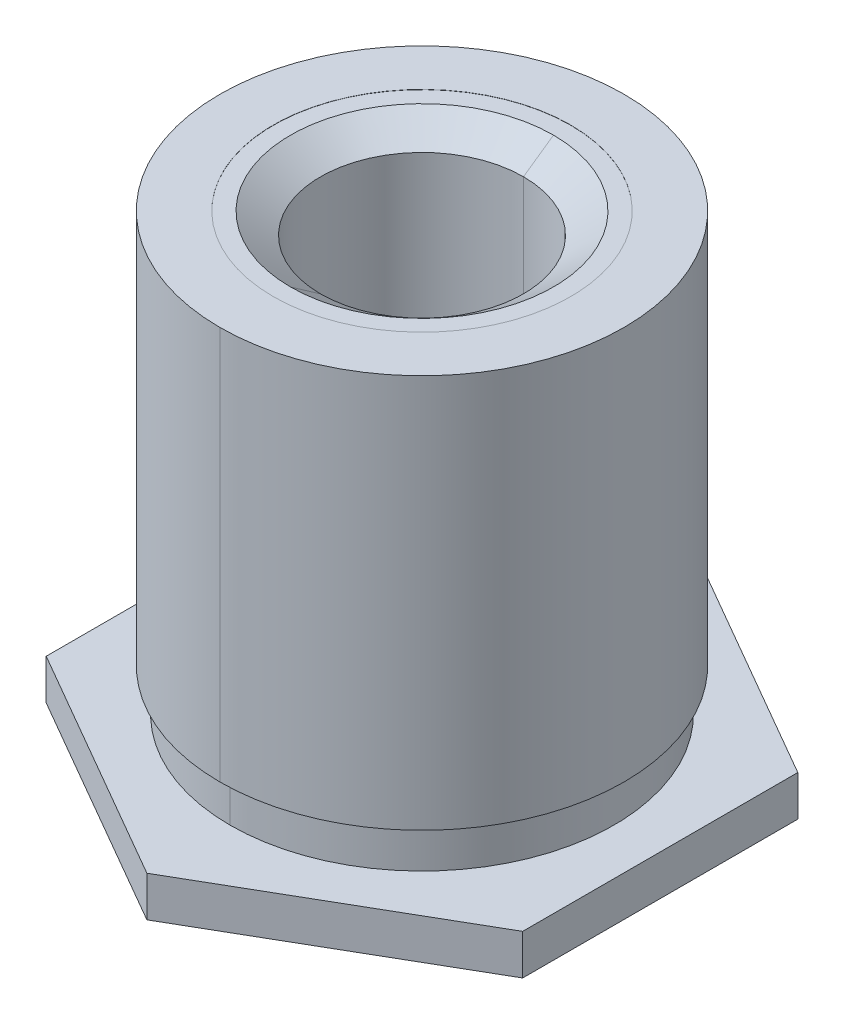
ISO-10303-21;
HEADER;
FILE_DESCRIPTION(('STEP AP214'),'2;1');
FILE_NAME('part.step','',(''),(''),'','','');
FILE_SCHEMA(('AUTOMOTIVE_DESIGN { 1 0 10303 214 1 1 1 1 }'));
ENDSEC;
DATA;
#1=APPLICATION_CONTEXT('core data for automotive mechanical design processes');
#2=APPLICATION_PROTOCOL_DEFINITION('international standard','automotive_design',2000,#1);
#3=PRODUCT_CONTEXT('',#1,'mechanical');
#4=PRODUCT('Part','Part','',(#3));
#5=PRODUCT_RELATED_PRODUCT_CATEGORY('part','',(#4));
#6=PRODUCT_DEFINITION_FORMATION('','',#4);
#7=PRODUCT_DEFINITION_CONTEXT('part definition',#1,'design');
#8=PRODUCT_DEFINITION('design','',#6,#7);
#9=PRODUCT_DEFINITION_SHAPE('','',#8);
#10=(LENGTH_UNIT() NAMED_UNIT(*) SI_UNIT(.MILLI.,.METRE.));
#11=(NAMED_UNIT(*) PLANE_ANGLE_UNIT() SI_UNIT($,.RADIAN.));
#12=(NAMED_UNIT(*) SI_UNIT($,.STERADIAN.) SOLID_ANGLE_UNIT());
#13=UNCERTAINTY_MEASURE_WITH_UNIT(LENGTH_MEASURE(1.E-05),#10,'distance_accuracy_value','');
#14=(GEOMETRIC_REPRESENTATION_CONTEXT(3) GLOBAL_UNCERTAINTY_ASSIGNED_CONTEXT((#13)) GLOBAL_UNIT_ASSIGNED_CONTEXT((#10,
#11,#12)) REPRESENTATION_CONTEXT('',''));
#15=CARTESIAN_POINT('',(0.,0.,0.));
#16=DIRECTION('',(0.,0.,1.));
#17=DIRECTION('',(1.,0.,0.));
#18=AXIS2_PLACEMENT_3D('',#15,#16,#17);
#19=CARTESIAN_POINT('',(3.175,0.,-1.83308710467706));
#20=DIRECTION('',(1.,0.,0.));
#21=DIRECTION('',(0.,1.,0.));
#22=AXIS2_PLACEMENT_3D('',#19,#20,#21);
#23=PLANE('',#22);
#24=DIRECTION('',(0.,0.,-1.));
#25=VECTOR('',#24,1.);
#26=CARTESIAN_POINT('',(3.175,0.53848,-1.83308710467706));
#27=LINE('',#26,#25);
#28=CARTESIAN_POINT('',(3.175,0.53848,1.83308710467706));
#29=VERTEX_POINT('',#28);
#30=CARTESIAN_POINT('',(3.175,0.53848,-1.83308710467706));
#31=VERTEX_POINT('',#30);
#32=EDGE_CURVE('E258',#29,#31,#27,.T.);
#33=ORIENTED_EDGE('',*,*,#32,.F.);
#34=DIRECTION('',(0.,1.,0.));
#35=VECTOR('',#34,1.);
#36=CARTESIAN_POINT('',(3.175,0.,1.83308710467706));
#37=LINE('',#36,#35);
#38=CARTESIAN_POINT('',(3.175,0.,1.83308710467706));
#39=VERTEX_POINT('',#38);
#40=EDGE_CURVE('E138',#39,#29,#37,.T.);
#41=ORIENTED_EDGE('',*,*,#40,.F.);
#42=DIRECTION('',(0.,0.,-1.));
#43=VECTOR('',#42,1.);
#44=CARTESIAN_POINT('',(3.175,0.,-1.83308710467706));
#45=LINE('',#44,#43);
#46=CARTESIAN_POINT('',(3.175,0.,-1.83308710467706));
#47=VERTEX_POINT('',#46);
#48=EDGE_CURVE('E242',#39,#47,#45,.T.);
#49=ORIENTED_EDGE('',*,*,#48,.T.);
#50=DIRECTION('',(0.,1.,0.));
#51=VECTOR('',#50,1.);
#52=CARTESIAN_POINT('',(3.175,0.,-1.83308710467706));
#53=LINE('',#52,#51);
#54=EDGE_CURVE('E11',#47,#31,#53,.T.);
#55=ORIENTED_EDGE('',*,*,#54,.T.);
#56=EDGE_LOOP('',(#33,#41,#49,#55));
#57=FACE_BOUND('',#56,.T.);
#58=ADVANCED_FACE('F16',(#57),#23,.T.);
#59=CARTESIAN_POINT('',(0.,0.,-3.66617420935412));
#60=DIRECTION('',(0.5,0.,-0.866025403784439));
#61=DIRECTION('',(0.,-1.,0.));
#62=AXIS2_PLACEMENT_3D('',#59,#60,#61);
#63=PLANE('',#62);
#64=DIRECTION('',(-0.866025403784439,0.,-0.5));
#65=VECTOR('',#64,1.);
#66=CARTESIAN_POINT('',(0.,0.53848,-3.66617420935412));
#67=LINE('',#66,#65);
#68=CARTESIAN_POINT('',(0.,0.53848,-3.66617420935412));
#69=VERTEX_POINT('',#68);
#70=EDGE_CURVE('E241',#31,#69,#67,.T.);
#71=ORIENTED_EDGE('',*,*,#70,.F.);
#72=ORIENTED_EDGE('',*,*,#54,.F.);
#73=DIRECTION('',(-0.866025403784439,0.,-0.5));
#74=VECTOR('',#73,1.);
#75=CARTESIAN_POINT('',(0.,0.,-3.66617420935412));
#76=LINE('',#75,#74);
#77=CARTESIAN_POINT('',(0.,0.,-3.66617420935412));
#78=VERTEX_POINT('',#77);
#79=EDGE_CURVE('E199',#47,#78,#76,.T.);
#80=ORIENTED_EDGE('',*,*,#79,.T.);
#81=DIRECTION('',(0.,1.,0.));
#82=VECTOR('',#81,1.);
#83=CARTESIAN_POINT('',(0.,0.,-3.66617420935412));
#84=LINE('',#83,#82);
#85=EDGE_CURVE('E27',#78,#69,#84,.T.);
#86=ORIENTED_EDGE('',*,*,#85,.T.);
#87=EDGE_LOOP('',(#71,#72,#80,#86));
#88=FACE_BOUND('',#87,.T.);
#89=ADVANCED_FACE('F435',(#88),#63,.T.);
#90=CARTESIAN_POINT('',(-3.175,0.,-1.83308710467706));
#91=DIRECTION('',(-0.5,0.,-0.866025403784439));
#92=DIRECTION('',(-0.866025403784439,0.,0.5));
#93=AXIS2_PLACEMENT_3D('',#90,#91,#92);
#94=PLANE('',#93);
#95=DIRECTION('',(-0.866025403784439,0.,0.5));
#96=VECTOR('',#95,1.);
#97=CARTESIAN_POINT('',(-3.175,0.53848,-1.83308710467706));
#98=LINE('',#97,#96);
#99=CARTESIAN_POINT('',(-3.175,0.53848,-1.83308710467706));
#100=VERTEX_POINT('',#99);
#101=EDGE_CURVE('E236',#69,#100,#98,.T.);
#102=ORIENTED_EDGE('',*,*,#101,.F.);
#103=ORIENTED_EDGE('',*,*,#85,.F.);
#104=DIRECTION('',(-0.866025403784439,0.,0.5));
#105=VECTOR('',#104,1.);
#106=CARTESIAN_POINT('',(-3.175,0.,-1.83308710467706));
#107=LINE('',#106,#105);
#108=CARTESIAN_POINT('',(-3.175,0.,-1.83308710467706));
#109=VERTEX_POINT('',#108);
#110=EDGE_CURVE('E320',#78,#109,#107,.T.);
#111=ORIENTED_EDGE('',*,*,#110,.T.);
#112=DIRECTION('',(0.,1.,0.));
#113=VECTOR('',#112,1.);
#114=CARTESIAN_POINT('',(-3.175,0.,-1.83308710467706));
#115=LINE('',#114,#113);
#116=EDGE_CURVE('E224',#109,#100,#115,.T.);
#117=ORIENTED_EDGE('',*,*,#116,.T.);
#118=EDGE_LOOP('',(#102,#103,#111,#117));
#119=FACE_BOUND('',#118,.T.);
#120=ADVANCED_FACE('F441',(#119),#94,.T.);
#121=CARTESIAN_POINT('',(-3.175,0.,1.83308710467706));
#122=DIRECTION('',(-1.,0.,0.));
#123=DIRECTION('',(0.,0.,1.));
#124=AXIS2_PLACEMENT_3D('',#121,#122,#123);
#125=PLANE('',#124);
#126=DIRECTION('',(0.,0.,1.));
#127=VECTOR('',#126,1.);
#128=CARTESIAN_POINT('',(-3.175,0.53848,1.83308710467706));
#129=LINE('',#128,#127);
#130=CARTESIAN_POINT('',(-3.175,0.53848,1.83308710467706));
#131=VERTEX_POINT('',#130);
#132=EDGE_CURVE('E240',#100,#131,#129,.T.);
#133=ORIENTED_EDGE('',*,*,#132,.F.);
#134=ORIENTED_EDGE('',*,*,#116,.F.);
#135=DIRECTION('',(0.,0.,1.));
#136=VECTOR('',#135,1.);
#137=CARTESIAN_POINT('',(-3.175,0.,1.83308710467706));
#138=LINE('',#137,#136);
#139=CARTESIAN_POINT('',(-3.175,0.,1.83308710467706));
#140=VERTEX_POINT('',#139);
#141=EDGE_CURVE('E323',#109,#140,#138,.T.);
#142=ORIENTED_EDGE('',*,*,#141,.T.);
#143=DIRECTION('',(0.,1.,0.));
#144=VECTOR('',#143,1.);
#145=CARTESIAN_POINT('',(-3.175,0.,1.83308710467706));
#146=LINE('',#145,#144);
#147=EDGE_CURVE('E20',#140,#131,#146,.T.);
#148=ORIENTED_EDGE('',*,*,#147,.T.);
#149=EDGE_LOOP('',(#133,#134,#142,#148));
#150=FACE_BOUND('',#149,.T.);
#151=ADVANCED_FACE('F476',(#150),#125,.T.);
#152=CARTESIAN_POINT('',(0.,0.,3.66617420935412));
#153=DIRECTION('',(-0.5,0.,0.866025403784439));
#154=DIRECTION('',(0.,1.,0.));
#155=AXIS2_PLACEMENT_3D('',#152,#153,#154);
#156=PLANE('',#155);
#157=DIRECTION('',(0.866025403784439,0.,0.5));
#158=VECTOR('',#157,1.);
#159=CARTESIAN_POINT('',(0.,0.53848,3.66617420935412));
#160=LINE('',#159,#158);
#161=CARTESIAN_POINT('',(0.,0.53848,3.66617420935412));
#162=VERTEX_POINT('',#161);
#163=EDGE_CURVE('E259',#131,#162,#160,.T.);
#164=ORIENTED_EDGE('',*,*,#163,.F.);
#165=ORIENTED_EDGE('',*,*,#147,.F.);
#166=DIRECTION('',(0.866025403784439,0.,0.5));
#167=VECTOR('',#166,1.);
#168=CARTESIAN_POINT('',(0.,0.,3.66617420935412));
#169=LINE('',#168,#167);
#170=CARTESIAN_POINT('',(0.,0.,3.66617420935412));
#171=VERTEX_POINT('',#170);
#172=EDGE_CURVE('E319',#140,#171,#169,.T.);
#173=ORIENTED_EDGE('',*,*,#172,.T.);
#174=DIRECTION('',(0.,1.,0.));
#175=VECTOR('',#174,1.);
#176=CARTESIAN_POINT('',(0.,0.,3.66617420935412));
#177=LINE('',#176,#175);
#178=EDGE_CURVE('E152',#171,#162,#177,.T.);
#179=ORIENTED_EDGE('',*,*,#178,.T.);
#180=EDGE_LOOP('',(#164,#165,#173,#179));
#181=FACE_BOUND('',#180,.T.);
#182=ADVANCED_FACE('F724',(#181),#156,.T.);
#183=CARTESIAN_POINT('',(3.175,0.,1.83308710467706));
#184=DIRECTION('',(0.5,0.,0.866025403784439));
#185=DIRECTION('',(0.,-1.,0.));
#186=AXIS2_PLACEMENT_3D('',#183,#184,#185);
#187=PLANE('',#186);
#188=DIRECTION('',(0.866025403784439,0.,-0.5));
#189=VECTOR('',#188,1.);
#190=CARTESIAN_POINT('',(3.175,0.53848,1.83308710467706));
#191=LINE('',#190,#189);
#192=EDGE_CURVE('E254',#162,#29,#191,.T.);
#193=ORIENTED_EDGE('',*,*,#192,.F.);
#194=ORIENTED_EDGE('',*,*,#178,.F.);
#195=DIRECTION('',(0.866025403784439,0.,-0.5));
#196=VECTOR('',#195,1.);
#197=CARTESIAN_POINT('',(3.175,0.,1.83308710467706));
#198=LINE('',#197,#196);
#199=EDGE_CURVE('E246',#171,#39,#198,.T.);
#200=ORIENTED_EDGE('',*,*,#199,.T.);
#201=ORIENTED_EDGE('',*,*,#40,.T.);
#202=EDGE_LOOP('',(#193,#194,#200,#201));
#203=FACE_BOUND('',#202,.T.);
#204=ADVANCED_FACE('F18',(#203),#187,.T.);
#205=CARTESIAN_POINT('',(0.,-2.54,0.));
#206=DIRECTION('',(0.,-1.,0.));
#207=DIRECTION('',(0.,0.,-1.));
#208=AXIS2_PLACEMENT_3D('',#205,#206,#207);
#209=CYLINDRICAL_SURFACE('',#208,1.9812);
#210=DIRECTION('',(0.,-1.,0.));
#211=VECTOR('',#210,1.);
#212=CARTESIAN_POINT('',(0.,-2.54,1.9812));
#213=LINE('',#212,#211);
#214=CARTESIAN_POINT('',(0.,6.35,1.9812));
#215=VERTEX_POINT('',#214);
#216=CARTESIAN_POINT('',(0.,6.34746,1.9812));
#217=VERTEX_POINT('',#216);
#218=EDGE_CURVE('E276',#215,#217,#213,.T.);
#219=ORIENTED_EDGE('',*,*,#218,.F.);
#220=CARTESIAN_POINT('',(0.,6.35,0.));
#221=DIRECTION('',(0.,1.,0.));
#222=DIRECTION('',(0.,0.,1.));
#223=AXIS2_PLACEMENT_3D('',#220,#221,#222);
#224=CIRCLE('',#223,1.9812);
#225=CARTESIAN_POINT('',(0.,6.35,-1.9812));
#226=VERTEX_POINT('',#225);
#227=EDGE_CURVE('E225',#215,#226,#224,.T.);
#228=ORIENTED_EDGE('',*,*,#227,.T.);
#229=DIRECTION('',(0.,-1.,0.));
#230=VECTOR('',#229,1.);
#231=CARTESIAN_POINT('',(0.,-2.54,-1.9812));
#232=LINE('',#231,#230);
#233=CARTESIAN_POINT('',(0.,6.34746,-1.9812));
#234=VERTEX_POINT('',#233);
#235=EDGE_CURVE('E291',#226,#234,#232,.T.);
#236=ORIENTED_EDGE('',*,*,#235,.T.);
#237=CARTESIAN_POINT('',(0.,6.34746,0.));
#238=DIRECTION('',(0.,-1.,0.));
#239=DIRECTION('',(0.,0.,-1.));
#240=AXIS2_PLACEMENT_3D('',#237,#238,#239);
#241=CIRCLE('',#240,1.9812);
#242=EDGE_CURVE('E279',#234,#217,#241,.T.);
#243=ORIENTED_EDGE('',*,*,#242,.T.);
#244=EDGE_LOOP('',(#219,#228,#236,#243));
#245=FACE_BOUND('',#244,.T.);
#246=ADVANCED_FACE('F461',(#245),#209,.F.);
#247=CARTESIAN_POINT('',(0.,6.06744601654146,0.));
#248=DIRECTION('',(0.,1.,0.));
#249=DIRECTION('',(0.,0.,1.));
#250=AXIS2_PLACEMENT_3D('',#247,#248,#249);
#251=CONICAL_SURFACE('',#250,1.35255,0.960105621522078);
#252=DIRECTION('',(0.,0.573433458613233,-0.819252139785345));
#253=VECTOR('',#252,1.);
#254=CARTESIAN_POINT('',(0.,6.06744601654146,-1.35255));
#255=LINE('',#254,#253);
#256=CARTESIAN_POINT('',(0.,6.06744601654146,-1.35255));
#257=VERTEX_POINT('',#256);
#258=CARTESIAN_POINT('',(0.,6.34746,-1.7526));
#259=VERTEX_POINT('',#258);
#260=EDGE_CURVE('E290',#257,#259,#255,.T.);
#261=ORIENTED_EDGE('',*,*,#260,.F.);
#262=CARTESIAN_POINT('',(0.,6.06744601654146,0.));
#263=DIRECTION('',(0.,-1.,0.));
#264=DIRECTION('',(0.,0.,-1.));
#265=AXIS2_PLACEMENT_3D('',#262,#263,#264);
#266=CIRCLE('',#265,1.35255);
#267=CARTESIAN_POINT('',(0.,6.06744601654146,1.35255));
#268=VERTEX_POINT('',#267);
#269=EDGE_CURVE('E228',#257,#268,#266,.T.);
#270=ORIENTED_EDGE('',*,*,#269,.T.);
#271=DIRECTION('',(0.,0.573433458613233,0.819252139785345));
#272=VECTOR('',#271,1.);
#273=CARTESIAN_POINT('',(0.,6.06744601654146,1.35255));
#274=LINE('',#273,#272);
#275=CARTESIAN_POINT('',(0.,6.34746,1.7526));
#276=VERTEX_POINT('',#275);
#277=EDGE_CURVE('E253',#268,#276,#274,.T.);
#278=ORIENTED_EDGE('',*,*,#277,.T.);
#279=CARTESIAN_POINT('',(0.,6.34746,0.));
#280=DIRECTION('',(0.,-1.,0.));
#281=DIRECTION('',(0.,0.,-1.));
#282=AXIS2_PLACEMENT_3D('',#279,#280,#281);
#283=CIRCLE('',#282,1.7526);
#284=EDGE_CURVE('E232',#259,#276,#283,.T.);
#285=ORIENTED_EDGE('',*,*,#284,.F.);
#286=EDGE_LOOP('',(#261,#270,#278,#285));
#287=FACE_BOUND('',#286,.T.);
#288=ADVANCED_FACE('F367',(#287),#251,.F.);
#289=CARTESIAN_POINT('',(1.9812,6.34746,0.));
#290=DIRECTION('',(0.,-1.,0.));
#291=DIRECTION('',(0.,0.,-1.));
#292=AXIS2_PLACEMENT_3D('',#289,#290,#291);
#293=PLANE('',#292);
#294=CARTESIAN_POINT('',(0.,6.34746,0.));
#295=DIRECTION('',(0.,-1.,0.));
#296=DIRECTION('',(0.,0.,-1.));
#297=AXIS2_PLACEMENT_3D('',#294,#295,#296);
#298=CIRCLE('',#297,1.7526);
#299=EDGE_CURVE('E309',#276,#259,#298,.T.);
#300=ORIENTED_EDGE('',*,*,#299,.T.);
#301=ORIENTED_EDGE('',*,*,#284,.T.);
#302=EDGE_LOOP('',(#300,#301));
#303=FACE_BOUND('',#302,.T.);
#304=ORIENTED_EDGE('',*,*,#242,.F.);
#305=CARTESIAN_POINT('',(0.,6.34746,0.));
#306=DIRECTION('',(0.,-1.,0.));
#307=DIRECTION('',(0.,0.,-1.));
#308=AXIS2_PLACEMENT_3D('',#305,#306,#307);
#309=CIRCLE('',#308,1.9812);
#310=EDGE_CURVE('E303',#217,#234,#309,.T.);
#311=ORIENTED_EDGE('',*,*,#310,.F.);
#312=EDGE_LOOP('',(#304,#311));
#313=FACE_BOUND('',#312,.T.);
#314=ADVANCED_FACE('F363',(#303,#313),#293,.F.);
#315=CARTESIAN_POINT('',(0.,0.,0.));
#316=DIRECTION('',(0.,-1.,0.));
#317=DIRECTION('',(0.,0.,-1.));
#318=AXIS2_PLACEMENT_3D('',#315,#316,#317);
#319=CYLINDRICAL_SURFACE('',#318,2.6924);
#320=DIRECTION('',(0.,-1.,0.));
#321=VECTOR('',#320,1.);
#322=CARTESIAN_POINT('',(0.,0.,2.6924));
#323=LINE('',#322,#321);
#324=CARTESIAN_POINT('',(0.,0.00254000000000007,2.6924));
#325=VERTEX_POINT('',#324);
#326=CARTESIAN_POINT('',(0.,0.,2.6924));
#327=VERTEX_POINT('',#326);
#328=EDGE_CURVE('E209',#325,#327,#323,.T.);
#329=ORIENTED_EDGE('',*,*,#328,.F.);
#330=CARTESIAN_POINT('',(0.,0.00254000000000007,0.));
#331=DIRECTION('',(0.,-1.,0.));
#332=DIRECTION('',(0.,0.,-1.));
#333=AXIS2_PLACEMENT_3D('',#330,#331,#332);
#334=CIRCLE('',#333,2.6924);
#335=CARTESIAN_POINT('',(0.,0.00254000000000007,-2.6924));
#336=VERTEX_POINT('',#335);
#337=EDGE_CURVE('E116',#336,#325,#334,.T.);
#338=ORIENTED_EDGE('',*,*,#337,.F.);
#339=DIRECTION('',(0.,-1.,0.));
#340=VECTOR('',#339,1.);
#341=CARTESIAN_POINT('',(0.,0.,-2.6924));
#342=LINE('',#341,#340);
#343=CARTESIAN_POINT('',(0.,0.,-2.6924));
#344=VERTEX_POINT('',#343);
#345=EDGE_CURVE('E201',#336,#344,#342,.T.);
#346=ORIENTED_EDGE('',*,*,#345,.T.);
#347=CARTESIAN_POINT('',(0.,0.,0.));
#348=DIRECTION('',(0.,-1.,0.));
#349=DIRECTION('',(0.,0.,-1.));
#350=AXIS2_PLACEMENT_3D('',#347,#348,#349);
#351=CIRCLE('',#350,2.6924);
#352=EDGE_CURVE('E191',#344,#327,#351,.T.);
#353=ORIENTED_EDGE('',*,*,#352,.T.);
#354=EDGE_LOOP('',(#329,#338,#346,#353));
#355=FACE_BOUND('',#354,.T.);
#356=ADVANCED_FACE('F202',(#355),#319,.F.);
#357=CARTESIAN_POINT('',(2.6924,0.00253999999999981,0.));
#358=DIRECTION('',(0.,-1.,0.));
#359=DIRECTION('',(0.,0.,-1.));
#360=AXIS2_PLACEMENT_3D('',#357,#358,#359);
#361=PLANE('',#360);
#362=CARTESIAN_POINT('',(0.,0.00253999999999981,0.));
#363=DIRECTION('',(0.,-1.,0.));
#364=DIRECTION('',(0.,0.,-1.));
#365=AXIS2_PLACEMENT_3D('',#362,#363,#364);
#366=CIRCLE('',#365,1.35255);
#367=CARTESIAN_POINT('',(0.,0.00253999999999981,-1.35255));
#368=VERTEX_POINT('',#367);
#369=CARTESIAN_POINT('',(0.,0.00253999999999981,1.35255));
#370=VERTEX_POINT('',#369);
#371=EDGE_CURVE('E280',#368,#370,#366,.T.);
#372=ORIENTED_EDGE('',*,*,#371,.F.);
#373=CARTESIAN_POINT('',(0.,0.00253999999999981,0.));
#374=DIRECTION('',(0.,-1.,0.));
#375=DIRECTION('',(0.,0.,-1.));
#376=AXIS2_PLACEMENT_3D('',#373,#374,#375);
#377=CIRCLE('',#376,1.35255);
#378=EDGE_CURVE('E250',#370,#368,#377,.T.);
#379=ORIENTED_EDGE('',*,*,#378,.F.);
#380=EDGE_LOOP('',(#372,#379));
#381=FACE_BOUND('',#380,.T.);
#382=ORIENTED_EDGE('',*,*,#337,.T.);
#383=CARTESIAN_POINT('',(0.,0.00254000000000007,0.));
#384=DIRECTION('',(0.,-1.,0.));
#385=DIRECTION('',(0.,0.,-1.));
#386=AXIS2_PLACEMENT_3D('',#383,#384,#385);
#387=CIRCLE('',#386,2.6924);
#388=EDGE_CURVE('E216',#325,#336,#387,.T.);
#389=ORIENTED_EDGE('',*,*,#388,.T.);
#390=EDGE_LOOP('',(#382,#389));
#391=FACE_BOUND('',#390,.T.);
#392=ADVANCED_FACE('F464',(#381,#391),#361,.T.);
#393=CARTESIAN_POINT('',(0.,0.,0.));
#394=DIRECTION('',(0.,-1.,0.));
#395=DIRECTION('',(0.,0.,-1.));
#396=AXIS2_PLACEMENT_3D('',#393,#394,#395);
#397=CYLINDRICAL_SURFACE('',#396,1.35255);
#398=DIRECTION('',(0.,-1.,0.));
#399=VECTOR('',#398,1.);
#400=CARTESIAN_POINT('',(0.,0.,1.35255));
#401=LINE('',#400,#399);
#402=EDGE_CURVE('E206',#268,#370,#401,.T.);
#403=ORIENTED_EDGE('',*,*,#402,.F.);
#404=ORIENTED_EDGE('',*,*,#269,.F.);
#405=DIRECTION('',(0.,-1.,0.));
#406=VECTOR('',#405,1.);
#407=CARTESIAN_POINT('',(0.,0.,-1.35255));
#408=LINE('',#407,#406);
#409=EDGE_CURVE('E302',#257,#368,#408,.T.);
#410=ORIENTED_EDGE('',*,*,#409,.T.);
#411=ORIENTED_EDGE('',*,*,#371,.T.);
#412=EDGE_LOOP('',(#403,#404,#410,#411));
#413=FACE_BOUND('',#412,.T.);
#414=ADVANCED_FACE('F466',(#413),#397,.F.);
#415=CARTESIAN_POINT('',(2.6924,6.35,0.));
#416=DIRECTION('',(0.,1.,0.));
#417=DIRECTION('',(1.,0.,0.));
#418=AXIS2_PLACEMENT_3D('',#415,#416,#417);
#419=PLANE('',#418);
#420=CARTESIAN_POINT('',(0.,6.35,0.));
#421=DIRECTION('',(0.,1.,0.));
#422=DIRECTION('',(0.,0.,1.));
#423=AXIS2_PLACEMENT_3D('',#420,#421,#422);
#424=CIRCLE('',#423,1.9812);
#425=EDGE_CURVE('E272',#226,#215,#424,.T.);
#426=ORIENTED_EDGE('',*,*,#425,.F.);
#427=ORIENTED_EDGE('',*,*,#227,.F.);
#428=EDGE_LOOP('',(#426,#427));
#429=FACE_BOUND('',#428,.T.);
#430=CARTESIAN_POINT('',(0.,6.35,0.));
#431=DIRECTION('',(0.,-1.,0.));
#432=DIRECTION('',(0.,0.,-1.));
#433=AXIS2_PLACEMENT_3D('',#430,#431,#432);
#434=CIRCLE('',#433,2.6924);
#435=CARTESIAN_POINT('',(0.,6.35,-2.6924));
#436=VERTEX_POINT('',#435);
#437=CARTESIAN_POINT('',(0.,6.35,2.6924));
#438=VERTEX_POINT('',#437);
#439=EDGE_CURVE('E375',#436,#438,#434,.T.);
#440=ORIENTED_EDGE('',*,*,#439,.F.);
#441=CARTESIAN_POINT('',(0.,6.35,0.));
#442=DIRECTION('',(0.,-1.,0.));
#443=DIRECTION('',(0.,0.,-1.));
#444=AXIS2_PLACEMENT_3D('',#441,#442,#443);
#445=CIRCLE('',#444,2.6924);
#446=EDGE_CURVE('E229',#438,#436,#445,.T.);
#447=ORIENTED_EDGE('',*,*,#446,.F.);
#448=EDGE_LOOP('',(#440,#447));
#449=FACE_BOUND('',#448,.T.);
#450=ADVANCED_FACE('F429',(#429,#449),#419,.T.);
#451=CARTESIAN_POINT('',(0.,0.,0.));
#452=DIRECTION('',(0.,-1.,0.));
#453=DIRECTION('',(0.,0.,-1.));
#454=AXIS2_PLACEMENT_3D('',#451,#452,#453);
#455=CYLINDRICAL_SURFACE('',#454,2.6924);
#456=DIRECTION('',(0.,-1.,0.));
#457=VECTOR('',#456,1.);
#458=CARTESIAN_POINT('',(0.,0.,2.6924));
#459=LINE('',#458,#457);
#460=CARTESIAN_POINT('',(0.,1.103884,2.6924));
#461=VERTEX_POINT('',#460);
#462=EDGE_CURVE('E327',#438,#461,#459,.T.);
#463=ORIENTED_EDGE('',*,*,#462,.F.);
#464=ORIENTED_EDGE('',*,*,#446,.T.);
#465=DIRECTION('',(0.,-1.,0.));
#466=VECTOR('',#465,1.);
#467=CARTESIAN_POINT('',(0.,0.,-2.6924));
#468=LINE('',#467,#466);
#469=CARTESIAN_POINT('',(0.,1.103884,-2.6924));
#470=VERTEX_POINT('',#469);
#471=EDGE_CURVE('E266',#436,#470,#468,.T.);
#472=ORIENTED_EDGE('',*,*,#471,.T.);
#473=CARTESIAN_POINT('',(0.,1.103884,0.));
#474=DIRECTION('',(0.,-1.,0.));
#475=DIRECTION('',(0.,0.,-1.));
#476=AXIS2_PLACEMENT_3D('',#473,#474,#475);
#477=CIRCLE('',#476,2.6924);
#478=EDGE_CURVE('E358',#461,#470,#477,.T.);
#479=ORIENTED_EDGE('',*,*,#478,.F.);
#480=EDGE_LOOP('',(#463,#464,#472,#479));
#481=FACE_BOUND('',#480,.T.);
#482=ADVANCED_FACE('F414',(#481),#455,.T.);
#483=CARTESIAN_POINT('',(2.6924,1.103884,0.));
#484=DIRECTION('',(0.,-1.,0.));
#485=DIRECTION('',(0.,0.,-1.));
#486=AXIS2_PLACEMENT_3D('',#483,#484,#485);
#487=PLANE('',#486);
#488=CARTESIAN_POINT('',(0.,1.103884,0.));
#489=DIRECTION('',(0.,-1.,0.));
#490=DIRECTION('',(0.,0.,-1.));
#491=AXIS2_PLACEMENT_3D('',#488,#489,#490);
#492=CIRCLE('',#491,2.55778);
#493=CARTESIAN_POINT('',(0.,1.103884,-2.55778));
#494=VERTEX_POINT('',#493);
#495=CARTESIAN_POINT('',(0.,1.103884,2.55778));
#496=VERTEX_POINT('',#495);
#497=EDGE_CURVE('E270',#494,#496,#492,.T.);
#498=ORIENTED_EDGE('',*,*,#497,.F.);
#499=CARTESIAN_POINT('',(0.,1.103884,0.));
#500=DIRECTION('',(0.,-1.,0.));
#501=DIRECTION('',(0.,0.,-1.));
#502=AXIS2_PLACEMENT_3D('',#499,#500,#501);
#503=CIRCLE('',#502,2.55778);
#504=EDGE_CURVE('E198',#496,#494,#503,.T.);
#505=ORIENTED_EDGE('',*,*,#504,.F.);
#506=EDGE_LOOP('',(#498,#505));
#507=FACE_BOUND('',#506,.T.);
#508=CARTESIAN_POINT('',(0.,1.103884,0.));
#509=DIRECTION('',(0.,-1.,0.));
#510=DIRECTION('',(0.,0.,-1.));
#511=AXIS2_PLACEMENT_3D('',#508,#509,#510);
#512=CIRCLE('',#511,2.6924);
#513=EDGE_CURVE('E271',#470,#461,#512,.T.);
#514=ORIENTED_EDGE('',*,*,#513,.T.);
#515=ORIENTED_EDGE('',*,*,#478,.T.);
#516=EDGE_LOOP('',(#514,#515));
#517=FACE_BOUND('',#516,.T.);
#518=ADVANCED_FACE('F417',(#507,#517),#487,.T.);
#519=CARTESIAN_POINT('',(0.,0.,0.));
#520=DIRECTION('',(0.,-1.,0.));
#521=DIRECTION('',(0.,0.,-1.));
#522=AXIS2_PLACEMENT_3D('',#519,#520,#521);
#523=CYLINDRICAL_SURFACE('',#522,2.55778);
#524=DIRECTION('',(0.,-1.,0.));
#525=VECTOR('',#524,1.);
#526=CARTESIAN_POINT('',(0.,0.,2.55778));
#527=LINE('',#526,#525);
#528=CARTESIAN_POINT('',(0.,0.53848,2.55778));
#529=VERTEX_POINT('',#528);
#530=EDGE_CURVE('E295',#496,#529,#527,.T.);
#531=ORIENTED_EDGE('',*,*,#530,.F.);
#532=ORIENTED_EDGE('',*,*,#504,.T.);
#533=DIRECTION('',(0.,-1.,0.));
#534=VECTOR('',#533,1.);
#535=CARTESIAN_POINT('',(0.,0.,-2.55778));
#536=LINE('',#535,#534);
#537=CARTESIAN_POINT('',(0.,0.53848,-2.55778));
#538=VERTEX_POINT('',#537);
#539=EDGE_CURVE('E281',#494,#538,#536,.T.);
#540=ORIENTED_EDGE('',*,*,#539,.T.);
#541=CARTESIAN_POINT('',(0.,0.53848,0.));
#542=DIRECTION('',(0.,-1.,0.));
#543=DIRECTION('',(0.,0.,-1.));
#544=AXIS2_PLACEMENT_3D('',#541,#542,#543);
#545=CIRCLE('',#544,2.55778);
#546=EDGE_CURVE('E220',#529,#538,#545,.T.);
#547=ORIENTED_EDGE('',*,*,#546,.F.);
#548=EDGE_LOOP('',(#531,#532,#540,#547));
#549=FACE_BOUND('',#548,.T.);
#550=ADVANCED_FACE('F419',(#549),#523,.T.);
#551=CARTESIAN_POINT('',(2.6924,0.,0.));
#552=DIRECTION('',(0.,-1.,0.));
#553=DIRECTION('',(0.,0.,-1.));
#554=AXIS2_PLACEMENT_3D('',#551,#552,#553);
#555=PLANE('',#554);
#556=ORIENTED_EDGE('',*,*,#352,.F.);
#557=CARTESIAN_POINT('',(0.,0.,0.));
#558=DIRECTION('',(0.,-1.,0.));
#559=DIRECTION('',(0.,0.,-1.));
#560=AXIS2_PLACEMENT_3D('',#557,#558,#559);
#561=CIRCLE('',#560,2.6924);
#562=EDGE_CURVE('E195',#327,#344,#561,.T.);
#563=ORIENTED_EDGE('',*,*,#562,.F.);
#564=EDGE_LOOP('',(#556,#563));
#565=FACE_BOUND('',#564,.T.);
#566=ORIENTED_EDGE('',*,*,#48,.F.);
#567=ORIENTED_EDGE('',*,*,#199,.F.);
#568=ORIENTED_EDGE('',*,*,#172,.F.);
#569=ORIENTED_EDGE('',*,*,#141,.F.);
#570=ORIENTED_EDGE('',*,*,#110,.F.);
#571=ORIENTED_EDGE('',*,*,#79,.F.);
#572=EDGE_LOOP('',(#566,#567,#568,#569,#570,#571));
#573=FACE_BOUND('',#572,.T.);
#574=ADVANCED_FACE('F192',(#565,#573),#555,.T.);
#575=CARTESIAN_POINT('',(3.683,0.53848,0.));
#576=DIRECTION('',(0.,1.,0.));
#577=DIRECTION('',(1.,0.,0.));
#578=AXIS2_PLACEMENT_3D('',#575,#576,#577);
#579=PLANE('',#578);
#580=CARTESIAN_POINT('',(0.,0.53848,0.));
#581=DIRECTION('',(0.,-1.,0.));
#582=DIRECTION('',(0.,0.,-1.));
#583=AXIS2_PLACEMENT_3D('',#580,#581,#582);
#584=CIRCLE('',#583,2.55778);
#585=EDGE_CURVE('E285',#538,#529,#584,.T.);
#586=ORIENTED_EDGE('',*,*,#585,.T.);
#587=ORIENTED_EDGE('',*,*,#546,.T.);
#588=EDGE_LOOP('',(#586,#587));
#589=FACE_BOUND('',#588,.T.);
#590=ORIENTED_EDGE('',*,*,#163,.T.);
#591=ORIENTED_EDGE('',*,*,#192,.T.);
#592=ORIENTED_EDGE('',*,*,#32,.T.);
#593=ORIENTED_EDGE('',*,*,#70,.T.);
#594=ORIENTED_EDGE('',*,*,#101,.T.);
#595=ORIENTED_EDGE('',*,*,#132,.T.);
#596=EDGE_LOOP('',(#590,#591,#592,#593,#594,#595));
#597=FACE_BOUND('',#596,.T.);
#598=ADVANCED_FACE('F450',(#589,#597),#579,.T.);
#599=CARTESIAN_POINT('',(0.,0.,0.));
#600=DIRECTION('',(0.,-1.,0.));
#601=DIRECTION('',(0.,0.,-1.));
#602=AXIS2_PLACEMENT_3D('',#599,#600,#601);
#603=CYLINDRICAL_SURFACE('',#602,2.55778);
#604=ORIENTED_EDGE('',*,*,#497,.T.);
#605=ORIENTED_EDGE('',*,*,#530,.T.);
#606=ORIENTED_EDGE('',*,*,#585,.F.);
#607=ORIENTED_EDGE('',*,*,#539,.F.);
#608=EDGE_LOOP('',(#604,#605,#606,#607));
#609=FACE_BOUND('',#608,.T.);
#610=ADVANCED_FACE('F452',(#609),#603,.T.);
#611=CARTESIAN_POINT('',(0.,0.,0.));
#612=DIRECTION('',(0.,-1.,0.));
#613=DIRECTION('',(0.,0.,-1.));
#614=AXIS2_PLACEMENT_3D('',#611,#612,#613);
#615=CYLINDRICAL_SURFACE('',#614,2.6924);
#616=ORIENTED_EDGE('',*,*,#439,.T.);
#617=ORIENTED_EDGE('',*,*,#462,.T.);
#618=ORIENTED_EDGE('',*,*,#513,.F.);
#619=ORIENTED_EDGE('',*,*,#471,.F.);
#620=EDGE_LOOP('',(#616,#617,#618,#619));
#621=FACE_BOUND('',#620,.T.);
#622=ADVANCED_FACE('F410',(#621),#615,.T.);
#623=CARTESIAN_POINT('',(0.,0.,0.));
#624=DIRECTION('',(0.,-1.,0.));
#625=DIRECTION('',(0.,0.,-1.));
#626=AXIS2_PLACEMENT_3D('',#623,#624,#625);
#627=CYLINDRICAL_SURFACE('',#626,1.35255);
#628=CARTESIAN_POINT('',(0.,6.06744601654146,0.));
#629=DIRECTION('',(0.,-1.,0.));
#630=DIRECTION('',(0.,0.,-1.));
#631=AXIS2_PLACEMENT_3D('',#628,#629,#630);
#632=CIRCLE('',#631,1.35255);
#633=EDGE_CURVE('E286',#268,#257,#632,.T.);
#634=ORIENTED_EDGE('',*,*,#633,.F.);
#635=ORIENTED_EDGE('',*,*,#402,.T.);
#636=ORIENTED_EDGE('',*,*,#378,.T.);
#637=ORIENTED_EDGE('',*,*,#409,.F.);
#638=EDGE_LOOP('',(#634,#635,#636,#637));
#639=FACE_BOUND('',#638,.T.);
#640=ADVANCED_FACE('F373',(#639),#627,.F.);
#641=CARTESIAN_POINT('',(0.,0.,0.));
#642=DIRECTION('',(0.,-1.,0.));
#643=DIRECTION('',(0.,0.,-1.));
#644=AXIS2_PLACEMENT_3D('',#641,#642,#643);
#645=CYLINDRICAL_SURFACE('',#644,2.6924);
#646=ORIENTED_EDGE('',*,*,#388,.F.);
#647=ORIENTED_EDGE('',*,*,#328,.T.);
#648=ORIENTED_EDGE('',*,*,#562,.T.);
#649=ORIENTED_EDGE('',*,*,#345,.F.);
#650=EDGE_LOOP('',(#646,#647,#648,#649));
#651=FACE_BOUND('',#650,.T.);
#652=ADVANCED_FACE('F208',(#651),#645,.F.);
#653=CARTESIAN_POINT('',(0.,6.06744601654146,0.));
#654=DIRECTION('',(0.,1.,0.));
#655=DIRECTION('',(0.,0.,1.));
#656=AXIS2_PLACEMENT_3D('',#653,#654,#655);
#657=CONICAL_SURFACE('',#656,1.35255,0.960105621522078);
#658=ORIENTED_EDGE('',*,*,#633,.T.);
#659=ORIENTED_EDGE('',*,*,#260,.T.);
#660=ORIENTED_EDGE('',*,*,#299,.F.);
#661=ORIENTED_EDGE('',*,*,#277,.F.);
#662=EDGE_LOOP('',(#658,#659,#660,#661));
#663=FACE_BOUND('',#662,.T.);
#664=ADVANCED_FACE('F370',(#663),#657,.F.);
#665=CARTESIAN_POINT('',(0.,-2.54,0.));
#666=DIRECTION('',(0.,-1.,0.));
#667=DIRECTION('',(0.,0.,-1.));
#668=AXIS2_PLACEMENT_3D('',#665,#666,#667);
#669=CYLINDRICAL_SURFACE('',#668,1.9812);
#670=ORIENTED_EDGE('',*,*,#425,.T.);
#671=ORIENTED_EDGE('',*,*,#218,.T.);
#672=ORIENTED_EDGE('',*,*,#310,.T.);
#673=ORIENTED_EDGE('',*,*,#235,.F.);
#674=EDGE_LOOP('',(#670,#671,#672,#673));
#675=FACE_BOUND('',#674,.T.);
#676=ADVANCED_FACE('F446',(#675),#669,.F.);
#677=CLOSED_SHELL('',(#58,#89,#120,#151,#182,#204,#246,#288,#314,#356,#392,#414,#450,#482,#518,
#550,#574,#598,#610,#622,#640,#652,#664,#676));
#678=MANIFOLD_SOLID_BREP('B1',#677);
#679=ADVANCED_BREP_SHAPE_REPRESENTATION('',(#18,#678),#14);
#680=SHAPE_DEFINITION_REPRESENTATION(#9,#679);
ENDSEC;
END-ISO-10303-21;
